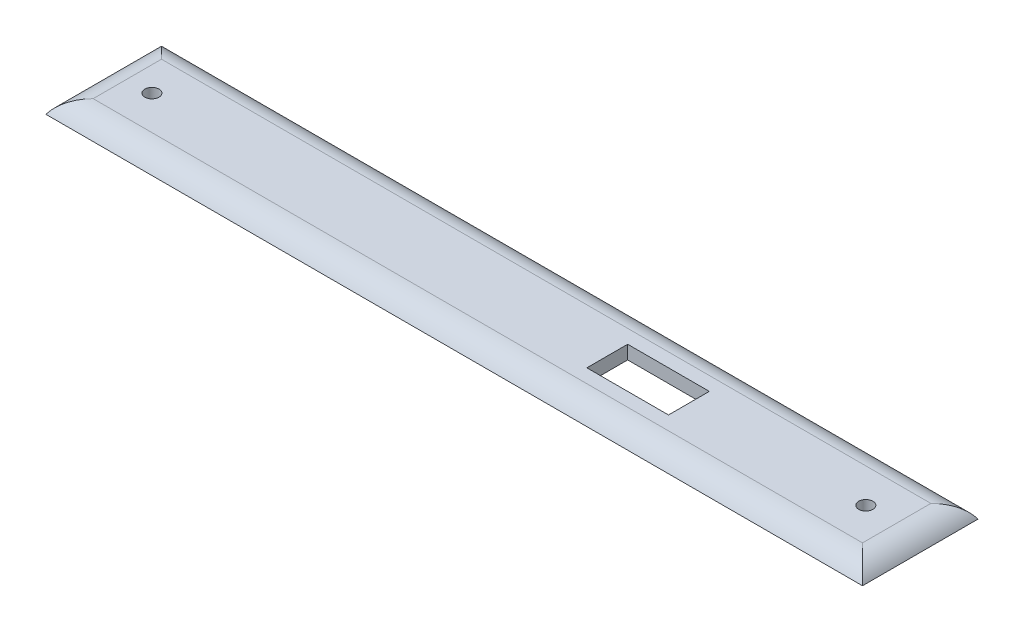
ISO-10303-21;
HEADER;
FILE_DESCRIPTION(('STEP AP214'),'2;1');
FILE_NAME('part.step','',(''),(''),'','','');
FILE_SCHEMA(('AUTOMOTIVE_DESIGN { 1 0 10303 214 1 1 1 1 }'));
ENDSEC;
DATA;
#1=APPLICATION_CONTEXT('core data for automotive mechanical design processes');
#2=APPLICATION_PROTOCOL_DEFINITION('international standard','automotive_design',2000,#1);
#3=PRODUCT_CONTEXT('',#1,'mechanical');
#4=PRODUCT('Part','Part','',(#3));
#5=PRODUCT_RELATED_PRODUCT_CATEGORY('part','',(#4));
#6=PRODUCT_DEFINITION_FORMATION('','',#4);
#7=PRODUCT_DEFINITION_CONTEXT('part definition',#1,'design');
#8=PRODUCT_DEFINITION('design','',#6,#7);
#9=PRODUCT_DEFINITION_SHAPE('','',#8);
#10=(LENGTH_UNIT() NAMED_UNIT(*) SI_UNIT(.MILLI.,.METRE.));
#11=(NAMED_UNIT(*) PLANE_ANGLE_UNIT() SI_UNIT($,.RADIAN.));
#12=(NAMED_UNIT(*) SI_UNIT($,.STERADIAN.) SOLID_ANGLE_UNIT());
#13=UNCERTAINTY_MEASURE_WITH_UNIT(LENGTH_MEASURE(1.E-05),#10,'distance_accuracy_value','');
#14=(GEOMETRIC_REPRESENTATION_CONTEXT(3) GLOBAL_UNCERTAINTY_ASSIGNED_CONTEXT((#13)) GLOBAL_UNIT_ASSIGNED_CONTEXT((#10,
#11,#12)) REPRESENTATION_CONTEXT('',''));
#15=CARTESIAN_POINT('',(0.,0.,0.));
#16=DIRECTION('',(0.,0.,1.));
#17=DIRECTION('',(1.,0.,0.));
#18=AXIS2_PLACEMENT_3D('',#15,#16,#17);
#19=CARTESIAN_POINT('',(0.,5.,0.));
#20=DIRECTION('',(0.,1.,0.));
#21=DIRECTION('',(0.,0.,1.));
#22=AXIS2_PLACEMENT_3D('',#19,#20,#21);
#23=PLANE('',#22);
#24=DIRECTION('',(-1.,0.,0.));
#25=VECTOR('',#24,1.);
#26=CARTESIAN_POINT('',(150.,5.,12.5547459621556));
#27=LINE('',#26,#25);
#28=CARTESIAN_POINT('',(-141.339745962156,5.,12.5547459621556));
#29=VERTEX_POINT('',#28);
#30=CARTESIAN_POINT('',(141.339745962156,5.,12.5547459621556));
#31=VERTEX_POINT('',#30);
#32=EDGE_CURVE('E59',#29,#31,#27,.F.);
#33=ORIENTED_EDGE('',*,*,#32,.T.);
#34=DIRECTION('',(0.,0.,-1.));
#35=VECTOR('',#34,1.);
#36=CARTESIAN_POINT('',(141.339745962156,5.,-21.215));
#37=LINE('',#36,#35);
#38=CARTESIAN_POINT('',(141.339745962156,5.,-12.5547459621556));
#39=VERTEX_POINT('',#38);
#40=EDGE_CURVE('E11',#31,#39,#37,.T.);
#41=ORIENTED_EDGE('',*,*,#40,.T.);
#42=DIRECTION('',(-1.,0.,0.));
#43=VECTOR('',#42,1.);
#44=CARTESIAN_POINT('',(-150.,5.,-12.5547459621556));
#45=LINE('',#44,#43);
#46=CARTESIAN_POINT('',(-141.339745962156,5.,-12.5547459621556));
#47=VERTEX_POINT('',#46);
#48=EDGE_CURVE('E178',#39,#47,#45,.T.);
#49=ORIENTED_EDGE('',*,*,#48,.T.);
#50=DIRECTION('',(0.,0.,-1.));
#51=VECTOR('',#50,1.);
#52=CARTESIAN_POINT('',(-141.339745962156,5.,21.215));
#53=LINE('',#52,#51);
#54=EDGE_CURVE('E201',#47,#29,#53,.F.);
#55=ORIENTED_EDGE('',*,*,#54,.T.);
#56=EDGE_LOOP('',(#33,#41,#49,#55));
#57=FACE_BOUND('',#56,.T.);
#58=CARTESIAN_POINT('',(130.,5.,0.));
#59=DIRECTION('',(0.,1.,0.));
#60=DIRECTION('',(0.,0.,1.));
#61=AXIS2_PLACEMENT_3D('',#58,#59,#60);
#62=CIRCLE('',#61,2.59999999999999);
#63=CARTESIAN_POINT('',(130.,5.,2.59999999999999));
#64=VERTEX_POINT('',#63);
#65=EDGE_CURVE('E169',#64,#64,#62,.T.);
#66=ORIENTED_EDGE('',*,*,#65,.F.);
#67=EDGE_LOOP('',(#66));
#68=FACE_BOUND('',#67,.T.);
#69=CARTESIAN_POINT('',(-132.3,5.,0.));
#70=DIRECTION('',(0.,1.,0.));
#71=DIRECTION('',(0.,0.,1.));
#72=AXIS2_PLACEMENT_3D('',#69,#70,#71);
#73=CIRCLE('',#72,2.59999999999999);
#74=CARTESIAN_POINT('',(-132.3,5.,2.59999999999999));
#75=VERTEX_POINT('',#74);
#76=EDGE_CURVE('E173',#75,#75,#73,.T.);
#77=ORIENTED_EDGE('',*,*,#76,.F.);
#78=EDGE_LOOP('',(#77));
#79=FACE_BOUND('',#78,.T.);
#80=DIRECTION('',(1.,0.,0.));
#81=VECTOR('',#80,1.);
#82=CARTESIAN_POINT('',(0.,5.,7.5));
#83=LINE('',#82,#81);
#84=CARTESIAN_POINT('',(35.,5.,7.5));
#85=VERTEX_POINT('',#84);
#86=CARTESIAN_POINT('',(65.,5.,7.5));
#87=VERTEX_POINT('',#86);
#88=EDGE_CURVE('E154',#85,#87,#83,.T.);
#89=ORIENTED_EDGE('',*,*,#88,.F.);
#90=DIRECTION('',(0.,0.,-1.));
#91=VECTOR('',#90,1.);
#92=CARTESIAN_POINT('',(35.,5.,0.));
#93=LINE('',#92,#91);
#94=CARTESIAN_POINT('',(35.,5.,-7.5));
#95=VERTEX_POINT('',#94);
#96=EDGE_CURVE('E67',#85,#95,#93,.T.);
#97=ORIENTED_EDGE('',*,*,#96,.T.);
#98=DIRECTION('',(1.,0.,0.));
#99=VECTOR('',#98,1.);
#100=CARTESIAN_POINT('',(0.,5.,-7.5));
#101=LINE('',#100,#99);
#102=CARTESIAN_POINT('',(65.,5.,-7.5));
#103=VERTEX_POINT('',#102);
#104=EDGE_CURVE('E138',#95,#103,#101,.T.);
#105=ORIENTED_EDGE('',*,*,#104,.T.);
#106=DIRECTION('',(0.,0.,-1.));
#107=VECTOR('',#106,1.);
#108=CARTESIAN_POINT('',(65.,5.,0.));
#109=LINE('',#108,#107);
#110=EDGE_CURVE('E145',#87,#103,#109,.T.);
#111=ORIENTED_EDGE('',*,*,#110,.F.);
#112=EDGE_LOOP('',(#89,#97,#105,#111));
#113=FACE_BOUND('',#112,.T.);
#114=ADVANCED_FACE('F49',(#57,#68,#79,#113),#23,.T.);
#115=CARTESIAN_POINT('',(0.,0.,0.));
#116=DIRECTION('',(0.,1.,0.));
#117=DIRECTION('',(0.,0.,1.));
#118=AXIS2_PLACEMENT_3D('',#115,#116,#117);
#119=PLANE('',#118);
#120=DIRECTION('',(0.,0.,1.));
#121=VECTOR('',#120,1.);
#122=CARTESIAN_POINT('',(-150.,0.,0.));
#123=LINE('',#122,#121);
#124=CARTESIAN_POINT('',(-150.,0.,-21.215));
#125=VERTEX_POINT('',#124);
#126=CARTESIAN_POINT('',(-150.,0.,21.215));
#127=VERTEX_POINT('',#126);
#128=EDGE_CURVE('E186',#125,#127,#123,.T.);
#129=ORIENTED_EDGE('',*,*,#128,.F.);
#130=DIRECTION('',(1.,0.,0.));
#131=VECTOR('',#130,1.);
#132=CARTESIAN_POINT('',(0.,0.,-21.215));
#133=LINE('',#132,#131);
#134=CARTESIAN_POINT('',(150.,0.,-21.215));
#135=VERTEX_POINT('',#134);
#136=EDGE_CURVE('E174',#125,#135,#133,.T.);
#137=ORIENTED_EDGE('',*,*,#136,.T.);
#138=DIRECTION('',(0.,0.,1.));
#139=VECTOR('',#138,1.);
#140=CARTESIAN_POINT('',(150.,0.,0.));
#141=LINE('',#140,#139);
#142=CARTESIAN_POINT('',(150.,0.,21.215));
#143=VERTEX_POINT('',#142);
#144=EDGE_CURVE('E194',#135,#143,#141,.T.);
#145=ORIENTED_EDGE('',*,*,#144,.T.);
#146=DIRECTION('',(1.,0.,0.));
#147=VECTOR('',#146,1.);
#148=CARTESIAN_POINT('',(0.,0.,21.215));
#149=LINE('',#148,#147);
#150=EDGE_CURVE('E190',#127,#143,#149,.T.);
#151=ORIENTED_EDGE('',*,*,#150,.F.);
#152=EDGE_LOOP('',(#129,#137,#145,#151));
#153=FACE_BOUND('',#152,.T.);
#154=CARTESIAN_POINT('',(-132.3,0.,0.));
#155=DIRECTION('',(0.,1.,0.));
#156=DIRECTION('',(0.,0.,1.));
#157=AXIS2_PLACEMENT_3D('',#154,#155,#156);
#158=CIRCLE('',#157,2.59999999999999);
#159=CARTESIAN_POINT('',(-132.3,0.,2.59999999999999));
#160=VERTEX_POINT('',#159);
#161=EDGE_CURVE('E183',#160,#160,#158,.T.);
#162=ORIENTED_EDGE('',*,*,#161,.T.);
#163=EDGE_LOOP('',(#162));
#164=FACE_BOUND('',#163,.T.);
#165=CARTESIAN_POINT('',(130.,0.,0.));
#166=DIRECTION('',(0.,1.,0.));
#167=DIRECTION('',(0.,0.,1.));
#168=AXIS2_PLACEMENT_3D('',#165,#166,#167);
#169=CIRCLE('',#168,2.59999999999999);
#170=CARTESIAN_POINT('',(130.,0.,2.59999999999999));
#171=VERTEX_POINT('',#170);
#172=EDGE_CURVE('E179',#171,#171,#169,.T.);
#173=ORIENTED_EDGE('',*,*,#172,.T.);
#174=EDGE_LOOP('',(#173));
#175=FACE_BOUND('',#174,.T.);
#176=DIRECTION('',(0.,0.,-1.));
#177=VECTOR('',#176,1.);
#178=CARTESIAN_POINT('',(35.,0.,0.));
#179=LINE('',#178,#177);
#180=CARTESIAN_POINT('',(35.,0.,7.5));
#181=VERTEX_POINT('',#180);
#182=CARTESIAN_POINT('',(35.,0.,-7.5));
#183=VERTEX_POINT('',#182);
#184=EDGE_CURVE('E120',#181,#183,#179,.T.);
#185=ORIENTED_EDGE('',*,*,#184,.F.);
#186=DIRECTION('',(1.,0.,0.));
#187=VECTOR('',#186,1.);
#188=CARTESIAN_POINT('',(0.,0.,7.5));
#189=LINE('',#188,#187);
#190=CARTESIAN_POINT('',(65.,0.,7.5));
#191=VERTEX_POINT('',#190);
#192=EDGE_CURVE('E130',#181,#191,#189,.T.);
#193=ORIENTED_EDGE('',*,*,#192,.T.);
#194=DIRECTION('',(0.,0.,-1.));
#195=VECTOR('',#194,1.);
#196=CARTESIAN_POINT('',(65.,0.,0.));
#197=LINE('',#196,#195);
#198=CARTESIAN_POINT('',(65.,0.,-7.5));
#199=VERTEX_POINT('',#198);
#200=EDGE_CURVE('E75',#191,#199,#197,.T.);
#201=ORIENTED_EDGE('',*,*,#200,.T.);
#202=DIRECTION('',(1.,0.,0.));
#203=VECTOR('',#202,1.);
#204=CARTESIAN_POINT('',(0.,0.,-7.5));
#205=LINE('',#204,#203);
#206=EDGE_CURVE('E127',#183,#199,#205,.T.);
#207=ORIENTED_EDGE('',*,*,#206,.F.);
#208=EDGE_LOOP('',(#185,#193,#201,#207));
#209=FACE_BOUND('',#208,.T.);
#210=ADVANCED_FACE('F136',(#153,#164,#175,#209),#119,.F.);
#211=CARTESIAN_POINT('',(-132.3,5.,0.));
#212=DIRECTION('',(0.,-1.,0.));
#213=DIRECTION('',(0.,0.,-1.));
#214=AXIS2_PLACEMENT_3D('',#211,#212,#213);
#215=CYLINDRICAL_SURFACE('',#214,2.59999999999999);
#216=ORIENTED_EDGE('',*,*,#76,.T.);
#217=EDGE_LOOP('',(#216));
#218=FACE_BOUND('',#217,.T.);
#219=ORIENTED_EDGE('',*,*,#161,.F.);
#220=EDGE_LOOP('',(#219));
#221=FACE_BOUND('',#220,.T.);
#222=ADVANCED_FACE('F239',(#218,#221),#215,.F.);
#223=CARTESIAN_POINT('',(130.,5.,0.));
#224=DIRECTION('',(0.,-1.,0.));
#225=DIRECTION('',(0.,0.,-1.));
#226=AXIS2_PLACEMENT_3D('',#223,#224,#225);
#227=CYLINDRICAL_SURFACE('',#226,2.59999999999999);
#228=ORIENTED_EDGE('',*,*,#65,.T.);
#229=EDGE_LOOP('',(#228));
#230=FACE_BOUND('',#229,.T.);
#231=ORIENTED_EDGE('',*,*,#172,.F.);
#232=EDGE_LOOP('',(#231));
#233=FACE_BOUND('',#232,.T.);
#234=ADVANCED_FACE('F245',(#230,#233),#227,.F.);
#235=CARTESIAN_POINT('',(-141.339745962156,-5.,0.));
#236=DIRECTION('',(0.,0.,1.));
#237=DIRECTION('',(1.,0.,0.));
#238=AXIS2_PLACEMENT_3D('',#235,#236,#237);
#239=CYLINDRICAL_SURFACE('',#238,10.);
#240=CARTESIAN_POINT('',(-141.339745962156,-5.,12.5547459621556));
#241=DIRECTION('',(0.707106781186547,0.,0.707106781186547));
#242=DIRECTION('',(-0.707106781186547,0.,0.707106781186547));
#243=AXIS2_PLACEMENT_3D('',#240,#241,#242);
#244=ELLIPSE('',#243,14.1421356237309,10.);
#245=EDGE_CURVE('E210',#29,#127,#244,.T.);
#246=ORIENTED_EDGE('',*,*,#245,.F.);
#247=ORIENTED_EDGE('',*,*,#54,.F.);
#248=CARTESIAN_POINT('',(-141.339745962156,-5.,-12.5547459621556));
#249=DIRECTION('',(0.707106781186547,0.,-0.707106781186547));
#250=DIRECTION('',(0.707106781186547,0.,0.707106781186547));
#251=AXIS2_PLACEMENT_3D('',#248,#249,#250);
#252=ELLIPSE('',#251,14.1421356237309,10.);
#253=EDGE_CURVE('E53',#125,#47,#252,.T.);
#254=ORIENTED_EDGE('',*,*,#253,.F.);
#255=ORIENTED_EDGE('',*,*,#128,.T.);
#256=EDGE_LOOP('',(#246,#247,#254,#255));
#257=FACE_BOUND('',#256,.T.);
#258=ADVANCED_FACE('F51',(#257),#239,.T.);
#259=CARTESIAN_POINT('',(0.,-5.,-12.5547459621556));
#260=DIRECTION('',(1.,0.,0.));
#261=DIRECTION('',(0.,0.,-1.));
#262=AXIS2_PLACEMENT_3D('',#259,#260,#261);
#263=CYLINDRICAL_SURFACE('',#262,10.);
#264=ORIENTED_EDGE('',*,*,#253,.T.);
#265=ORIENTED_EDGE('',*,*,#48,.F.);
#266=CARTESIAN_POINT('',(141.339745962156,-5.,-12.5547459621556));
#267=DIRECTION('',(0.707106781186547,0.,0.707106781186547));
#268=DIRECTION('',(0.707106781186547,0.,-0.707106781186547));
#269=AXIS2_PLACEMENT_3D('',#266,#267,#268);
#270=ELLIPSE('',#269,14.1421356237309,10.);
#271=EDGE_CURVE('E208',#135,#39,#270,.T.);
#272=ORIENTED_EDGE('',*,*,#271,.F.);
#273=ORIENTED_EDGE('',*,*,#136,.F.);
#274=EDGE_LOOP('',(#264,#265,#272,#273));
#275=FACE_BOUND('',#274,.T.);
#276=ADVANCED_FACE('F224',(#275),#263,.T.);
#277=CARTESIAN_POINT('',(0.,-5.,12.5547459621556));
#278=DIRECTION('',(1.,0.,0.));
#279=DIRECTION('',(0.,0.,-1.));
#280=AXIS2_PLACEMENT_3D('',#277,#278,#279);
#281=CYLINDRICAL_SURFACE('',#280,10.);
#282=ORIENTED_EDGE('',*,*,#245,.T.);
#283=ORIENTED_EDGE('',*,*,#150,.T.);
#284=CARTESIAN_POINT('',(141.339745962156,-5.,12.5547459621556));
#285=DIRECTION('',(0.707106781186547,0.,-0.707106781186547));
#286=DIRECTION('',(0.707106781186547,0.,0.707106781186547));
#287=AXIS2_PLACEMENT_3D('',#284,#285,#286);
#288=ELLIPSE('',#287,14.1421356237309,10.);
#289=EDGE_CURVE('E163',#31,#143,#288,.T.);
#290=ORIENTED_EDGE('',*,*,#289,.F.);
#291=ORIENTED_EDGE('',*,*,#32,.F.);
#292=EDGE_LOOP('',(#282,#283,#290,#291));
#293=FACE_BOUND('',#292,.T.);
#294=ADVANCED_FACE('F235',(#293),#281,.T.);
#295=CARTESIAN_POINT('',(141.339745962156,-5.,0.));
#296=DIRECTION('',(0.,0.,1.));
#297=DIRECTION('',(1.,0.,0.));
#298=AXIS2_PLACEMENT_3D('',#295,#296,#297);
#299=CYLINDRICAL_SURFACE('',#298,10.);
#300=ORIENTED_EDGE('',*,*,#271,.T.);
#301=ORIENTED_EDGE('',*,*,#40,.F.);
#302=ORIENTED_EDGE('',*,*,#289,.T.);
#303=ORIENTED_EDGE('',*,*,#144,.F.);
#304=EDGE_LOOP('',(#300,#301,#302,#303));
#305=FACE_BOUND('',#304,.T.);
#306=ADVANCED_FACE('F233',(#305),#299,.T.);
#307=CARTESIAN_POINT('',(35.,0.,0.));
#308=DIRECTION('',(1.,0.,0.));
#309=DIRECTION('',(0.,0.,-1.));
#310=AXIS2_PLACEMENT_3D('',#307,#308,#309);
#311=PLANE('',#310);
#312=ORIENTED_EDGE('',*,*,#96,.F.);
#313=DIRECTION('',(0.,1.,0.));
#314=VECTOR('',#313,1.);
#315=CARTESIAN_POINT('',(35.,0.,7.5));
#316=LINE('',#315,#314);
#317=EDGE_CURVE('E116',#181,#85,#316,.T.);
#318=ORIENTED_EDGE('',*,*,#317,.F.);
#319=ORIENTED_EDGE('',*,*,#184,.T.);
#320=DIRECTION('',(0.,1.,0.));
#321=VECTOR('',#320,1.);
#322=CARTESIAN_POINT('',(35.,0.,-7.5));
#323=LINE('',#322,#321);
#324=EDGE_CURVE('E160',#183,#95,#323,.T.);
#325=ORIENTED_EDGE('',*,*,#324,.T.);
#326=EDGE_LOOP('',(#312,#318,#319,#325));
#327=FACE_BOUND('',#326,.T.);
#328=ADVANCED_FACE('F118',(#327),#311,.T.);
#329=CARTESIAN_POINT('',(0.,0.,-7.5));
#330=DIRECTION('',(0.,0.,1.));
#331=DIRECTION('',(1.,0.,0.));
#332=AXIS2_PLACEMENT_3D('',#329,#330,#331);
#333=PLANE('',#332);
#334=ORIENTED_EDGE('',*,*,#104,.F.);
#335=ORIENTED_EDGE('',*,*,#324,.F.);
#336=ORIENTED_EDGE('',*,*,#206,.T.);
#337=DIRECTION('',(0.,1.,0.));
#338=VECTOR('',#337,1.);
#339=CARTESIAN_POINT('',(65.,0.,-7.5));
#340=LINE('',#339,#338);
#341=EDGE_CURVE('E164',#199,#103,#340,.T.);
#342=ORIENTED_EDGE('',*,*,#341,.T.);
#343=EDGE_LOOP('',(#334,#335,#336,#342));
#344=FACE_BOUND('',#343,.T.);
#345=ADVANCED_FACE('F263',(#344),#333,.T.);
#346=CARTESIAN_POINT('',(65.,0.,0.));
#347=DIRECTION('',(1.,0.,0.));
#348=DIRECTION('',(0.,0.,-1.));
#349=AXIS2_PLACEMENT_3D('',#346,#347,#348);
#350=PLANE('',#349);
#351=ORIENTED_EDGE('',*,*,#110,.T.);
#352=ORIENTED_EDGE('',*,*,#341,.F.);
#353=ORIENTED_EDGE('',*,*,#200,.F.);
#354=DIRECTION('',(0.,1.,0.));
#355=VECTOR('',#354,1.);
#356=CARTESIAN_POINT('',(65.,0.,7.5));
#357=LINE('',#356,#355);
#358=EDGE_CURVE('E126',#191,#87,#357,.T.);
#359=ORIENTED_EDGE('',*,*,#358,.T.);
#360=EDGE_LOOP('',(#351,#352,#353,#359));
#361=FACE_BOUND('',#360,.T.);
#362=ADVANCED_FACE('F266',(#361),#350,.F.);
#363=CARTESIAN_POINT('',(0.,0.,7.5));
#364=DIRECTION('',(0.,0.,1.));
#365=DIRECTION('',(1.,0.,0.));
#366=AXIS2_PLACEMENT_3D('',#363,#364,#365);
#367=PLANE('',#366);
#368=ORIENTED_EDGE('',*,*,#88,.T.);
#369=ORIENTED_EDGE('',*,*,#358,.F.);
#370=ORIENTED_EDGE('',*,*,#192,.F.);
#371=ORIENTED_EDGE('',*,*,#317,.T.);
#372=EDGE_LOOP('',(#368,#369,#370,#371));
#373=FACE_BOUND('',#372,.T.);
#374=ADVANCED_FACE('F131',(#373),#367,.F.);
#375=CLOSED_SHELL('',(#114,#210,#222,#234,#258,#276,#294,#306,#328,#345,#362,#374));
#376=MANIFOLD_SOLID_BREP('B2',#375);
#377=ADVANCED_BREP_SHAPE_REPRESENTATION('',(#18,#376),#14);
#378=SHAPE_DEFINITION_REPRESENTATION(#9,#377);
ENDSEC;
END-ISO-10303-21;
